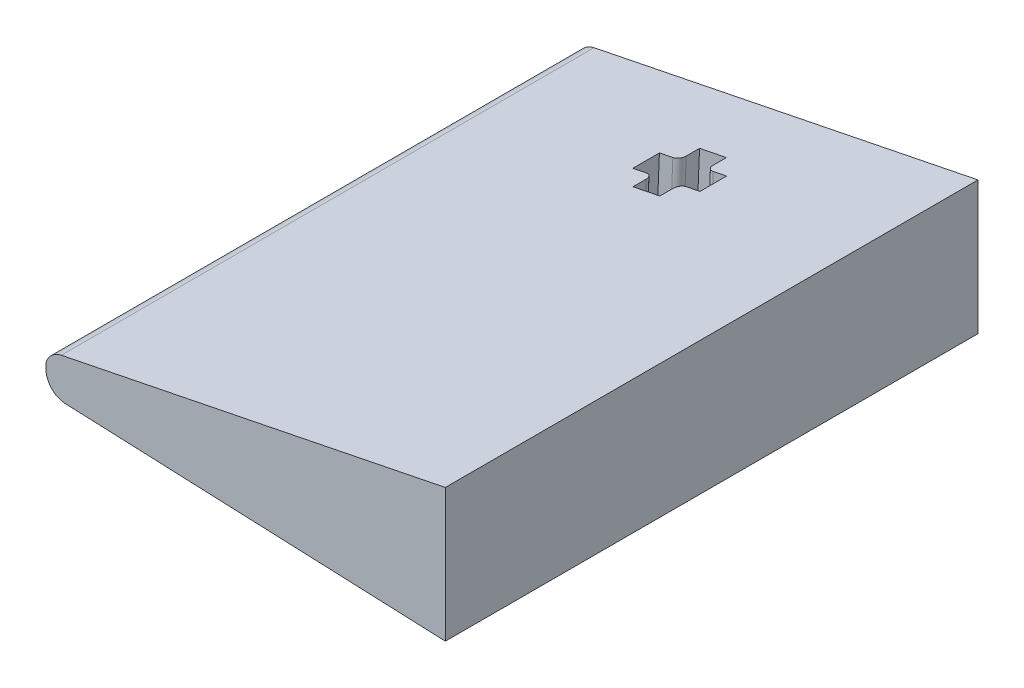
ISO-10303-21;
HEADER;
FILE_DESCRIPTION(('STEP AP214'),'2;1');
FILE_NAME('part.step','',(''),(''),'','','');
FILE_SCHEMA(('AUTOMOTIVE_DESIGN { 1 0 10303 214 1 1 1 1 }'));
ENDSEC;
DATA;
#1=APPLICATION_CONTEXT('core data for automotive mechanical design processes');
#2=APPLICATION_PROTOCOL_DEFINITION('international standard','automotive_design',2000,#1);
#3=PRODUCT_CONTEXT('',#1,'mechanical');
#4=PRODUCT('Part','Part','',(#3));
#5=PRODUCT_RELATED_PRODUCT_CATEGORY('part','',(#4));
#6=PRODUCT_DEFINITION_FORMATION('','',#4);
#7=PRODUCT_DEFINITION_CONTEXT('part definition',#1,'design');
#8=PRODUCT_DEFINITION('design','',#6,#7);
#9=PRODUCT_DEFINITION_SHAPE('','',#8);
#10=(LENGTH_UNIT() NAMED_UNIT(*) SI_UNIT(.MILLI.,.METRE.));
#11=(NAMED_UNIT(*) PLANE_ANGLE_UNIT() SI_UNIT($,.RADIAN.));
#12=(NAMED_UNIT(*) SI_UNIT($,.STERADIAN.) SOLID_ANGLE_UNIT());
#13=UNCERTAINTY_MEASURE_WITH_UNIT(LENGTH_MEASURE(1.E-05),#10,'distance_accuracy_value','');
#14=(GEOMETRIC_REPRESENTATION_CONTEXT(3) GLOBAL_UNCERTAINTY_ASSIGNED_CONTEXT((#13)) GLOBAL_UNIT_ASSIGNED_CONTEXT((#10,
#11,#12)) REPRESENTATION_CONTEXT('',''));
#15=CARTESIAN_POINT('',(0.,0.,0.));
#16=DIRECTION('',(0.,0.,1.));
#17=DIRECTION('',(1.,0.,0.));
#18=AXIS2_PLACEMENT_3D('',#15,#16,#17);
#19=CARTESIAN_POINT('',(1.21503963381001,-0.459096074768694,40.));
#20=DIRECTION('',(0.197787576974888,-0.980244905314178,0.));
#21=DIRECTION('',(0.980244905314178,0.197787576974888,0.));
#22=AXIS2_PLACEMENT_3D('',#19,#20,#21);
#23=PLANE('',#22);
#24=DIRECTION('',(-0.980244905314178,-0.197787576974888,0.));
#25=VECTOR('',#24,1.);
#26=CARTESIAN_POINT('',(1.21503963381001,-0.459096074768694,0.));
#27=LINE('',#26,#25);
#28=CARTESIAN_POINT('',(30.0476653891835,5.35856760811605,0.));
#29=VERTEX_POINT('',#28);
#30=CARTESIAN_POINT('',(1.21503963381001,-0.459096074768694,0.));
#31=VERTEX_POINT('',#30);
#32=EDGE_CURVE('E329',#29,#31,#27,.T.);
#33=ORIENTED_EDGE('',*,*,#32,.T.);
#34=DIRECTION('',(0.,0.,-1.));
#35=VECTOR('',#34,1.);
#36=CARTESIAN_POINT('',(1.21503963381001,-0.459096074768694,40.));
#37=LINE('',#36,#35);
#38=CARTESIAN_POINT('',(1.21503963381001,-0.459096074768694,40.));
#39=VERTEX_POINT('',#38);
#40=EDGE_CURVE('E41',#39,#31,#37,.T.);
#41=ORIENTED_EDGE('',*,*,#40,.F.);
#42=DIRECTION('',(-0.980244905314178,-0.197787576974888,0.));
#43=VECTOR('',#42,1.);
#44=CARTESIAN_POINT('',(1.21503963381001,-0.459096074768694,40.));
#45=LINE('',#44,#43);
#46=CARTESIAN_POINT('',(30.0476653891835,5.35856760811605,40.));
#47=VERTEX_POINT('',#46);
#48=EDGE_CURVE('E316',#47,#39,#45,.T.);
#49=ORIENTED_EDGE('',*,*,#48,.F.);
#50=DIRECTION('',(0.,0.,-1.));
#51=VECTOR('',#50,1.);
#52=CARTESIAN_POINT('',(30.0476653891835,5.35856760811605,40.));
#53=LINE('',#52,#51);
#54=EDGE_CURVE('E11',#47,#29,#53,.T.);
#55=ORIENTED_EDGE('',*,*,#54,.T.);
#56=EDGE_LOOP('',(#33,#41,#49,#55));
#57=FACE_BOUND('',#56,.T.);
#58=DIRECTION('',(-0.980244905314178,-0.197787576974888,0.));
#59=VECTOR('',#58,1.);
#60=CARTESIAN_POINT('',(1.21503963381001,-0.459096074768694,5.23864527795705));
#61=LINE('',#60,#59);
#62=CARTESIAN_POINT('',(16.3956877775301,2.60395847106687,5.23864527795705));
#63=VERTEX_POINT('',#62);
#64=CARTESIAN_POINT('',(14.3770940319794,2.19665947500511,5.23864527795705));
#65=VERTEX_POINT('',#64);
#66=EDGE_CURVE('E308',#63,#65,#61,.T.);
#67=ORIENTED_EDGE('',*,*,#66,.F.);
#68=DIRECTION('',(0.,0.,1.));
#69=VECTOR('',#68,1.);
#70=CARTESIAN_POINT('',(16.3956877775301,2.60395847106687,40.));
#71=LINE('',#70,#69);
#72=CARTESIAN_POINT('',(16.3956877775301,2.60395847106687,6.23864527795705));
#73=VERTEX_POINT('',#72);
#74=EDGE_CURVE('E310',#63,#73,#71,.T.);
#75=ORIENTED_EDGE('',*,*,#74,.T.);
#76=CARTESIAN_POINT('',(16.9003362139178,2.7057832200823,6.23864527795706));
#77=DIRECTION('',(0.197787576974888,-0.980244905314178,0.));
#78=DIRECTION('',(-0.980244905314178,-0.197787576974888,0.));
#79=AXIS2_PLACEMENT_3D('',#76,#77,#78);
#80=ELLIPSE('',#79,0.514818729127623,0.5);
#81=CARTESIAN_POINT('',(16.9003362139178,2.7057832200823,6.73864527795706));
#82=VERTEX_POINT('',#81);
#83=EDGE_CURVE('E244',#73,#82,#80,.F.);
#84=ORIENTED_EDGE('',*,*,#83,.T.);
#85=DIRECTION('',(0.980244905314178,0.197787576974888,0.));
#86=VECTOR('',#85,1.);
#87=CARTESIAN_POINT('',(1.21503963381001,-0.459096074768694,6.73864527795705));
#88=LINE('',#87,#86);
#89=CARTESIAN_POINT('',(17.9096330866932,2.90943271811318,6.73864527795705));
#90=VERTEX_POINT('',#89);
#91=EDGE_CURVE('E188',#82,#90,#88,.T.);
#92=ORIENTED_EDGE('',*,*,#91,.T.);
#93=DIRECTION('',(0.,0.,-1.));
#94=VECTOR('',#93,1.);
#95=CARTESIAN_POINT('',(17.9096330866932,2.9094327181132,40.));
#96=LINE('',#95,#94);
#97=CARTESIAN_POINT('',(17.9096330866932,2.90943271811323,8.73864527795706));
#98=VERTEX_POINT('',#97);
#99=EDGE_CURVE('E273',#98,#90,#96,.T.);
#100=ORIENTED_EDGE('',*,*,#99,.F.);
#101=DIRECTION('',(-0.980244905314178,-0.197787576974888,0.));
#102=VECTOR('',#101,1.);
#103=CARTESIAN_POINT('',(1.21503963381001,-0.459096074768694,8.73864527795706));
#104=LINE('',#103,#102);
#105=CARTESIAN_POINT('',(16.9003362139178,2.70578322008229,8.73864527795706));
#106=VERTEX_POINT('',#105);
#107=EDGE_CURVE('E275',#98,#106,#104,.T.);
#108=ORIENTED_EDGE('',*,*,#107,.T.);
#109=CARTESIAN_POINT('',(16.9003362139178,2.7057832200823,9.23864527795706));
#110=DIRECTION('',(0.197787576974888,-0.980244905314178,0.));
#111=DIRECTION('',(-0.980244905314178,-0.197787576974888,0.));
#112=AXIS2_PLACEMENT_3D('',#109,#110,#111);
#113=ELLIPSE('',#112,0.514818729127624,0.5);
#114=CARTESIAN_POINT('',(16.3956877775301,2.60395847106687,9.23864527795706));
#115=VERTEX_POINT('',#114);
#116=EDGE_CURVE('E278',#106,#115,#113,.F.);
#117=ORIENTED_EDGE('',*,*,#116,.T.);
#118=DIRECTION('',(0.,0.,1.));
#119=VECTOR('',#118,1.);
#120=CARTESIAN_POINT('',(16.3956877775301,2.60395847106687,40.));
#121=LINE('',#120,#119);
#122=CARTESIAN_POINT('',(16.3956877775301,2.6039584710669,10.2386452779571));
#123=VERTEX_POINT('',#122);
#124=EDGE_CURVE('E281',#115,#123,#121,.T.);
#125=ORIENTED_EDGE('',*,*,#124,.T.);
#126=DIRECTION('',(-0.980244905314178,-0.197787576974888,0.));
#127=VECTOR('',#126,1.);
#128=CARTESIAN_POINT('',(1.21503963381001,-0.459096074768694,10.2386452779571));
#129=LINE('',#128,#127);
#130=CARTESIAN_POINT('',(14.3770940319794,2.19665947500507,10.2386452779571));
#131=VERTEX_POINT('',#130);
#132=EDGE_CURVE('E284',#123,#131,#129,.T.);
#133=ORIENTED_EDGE('',*,*,#132,.T.);
#134=DIRECTION('',(0.,0.,-1.));
#135=VECTOR('',#134,1.);
#136=CARTESIAN_POINT('',(14.3770940319794,2.19665947500509,40.));
#137=LINE('',#136,#135);
#138=CARTESIAN_POINT('',(14.3770940319794,2.19665947500511,9.23864527795706));
#139=VERTEX_POINT('',#138);
#140=EDGE_CURVE('E287',#131,#139,#137,.T.);
#141=ORIENTED_EDGE('',*,*,#140,.T.);
#142=CARTESIAN_POINT('',(13.8724455955918,2.09483472598965,9.23864527795706));
#143=DIRECTION('',(0.197787576974888,-0.980244905314178,0.));
#144=DIRECTION('',(-0.980244905314178,-0.197787576974888,0.));
#145=AXIS2_PLACEMENT_3D('',#142,#143,#144);
#146=ELLIPSE('',#145,0.514818729127624,0.5);
#147=CARTESIAN_POINT('',(13.8724455955918,2.09483472598965,8.73864527795706));
#148=VERTEX_POINT('',#147);
#149=EDGE_CURVE('E290',#139,#148,#146,.F.);
#150=ORIENTED_EDGE('',*,*,#149,.T.);
#151=DIRECTION('',(-0.980244905314178,-0.197787576974888,0.));
#152=VECTOR('',#151,1.);
#153=CARTESIAN_POINT('',(1.21503963381001,-0.459096074768694,8.73864527795706));
#154=LINE('',#153,#152);
#155=CARTESIAN_POINT('',(12.8631487228164,1.89118522795874,8.73864527795706));
#156=VERTEX_POINT('',#155);
#157=EDGE_CURVE('E293',#148,#156,#154,.T.);
#158=ORIENTED_EDGE('',*,*,#157,.T.);
#159=DIRECTION('',(0.,0.,-1.));
#160=VECTOR('',#159,1.);
#161=CARTESIAN_POINT('',(12.8631487228164,1.89118522795876,40.));
#162=LINE('',#161,#160);
#163=CARTESIAN_POINT('',(12.8631487228164,1.89118522795878,6.73864527795706));
#164=VERTEX_POINT('',#163);
#165=EDGE_CURVE('E296',#156,#164,#162,.T.);
#166=ORIENTED_EDGE('',*,*,#165,.T.);
#167=DIRECTION('',(0.980244905314178,0.197787576974888,0.));
#168=VECTOR('',#167,1.);
#169=CARTESIAN_POINT('',(1.21503963381001,-0.459096074768694,6.73864527795705));
#170=LINE('',#169,#168);
#171=CARTESIAN_POINT('',(13.8724455955918,2.09483472598964,6.73864527795706));
#172=VERTEX_POINT('',#171);
#173=EDGE_CURVE('E299',#164,#172,#170,.T.);
#174=ORIENTED_EDGE('',*,*,#173,.T.);
#175=CARTESIAN_POINT('',(13.8724455955918,2.09483472598965,6.23864527795706));
#176=DIRECTION('',(0.197787576974888,-0.980244905314178,0.));
#177=DIRECTION('',(-0.980244905314178,-0.197787576974888,0.));
#178=AXIS2_PLACEMENT_3D('',#175,#176,#177);
#179=ELLIPSE('',#178,0.514818729127623,0.5);
#180=CARTESIAN_POINT('',(14.3770940319794,2.19665947500511,6.23864527795705));
#181=VERTEX_POINT('',#180);
#182=EDGE_CURVE('E302',#172,#181,#179,.F.);
#183=ORIENTED_EDGE('',*,*,#182,.T.);
#184=DIRECTION('',(0.,0.,-1.));
#185=VECTOR('',#184,1.);
#186=CARTESIAN_POINT('',(14.3770940319794,2.19665947500509,40.));
#187=LINE('',#186,#185);
#188=EDGE_CURVE('E305',#181,#65,#187,.T.);
#189=ORIENTED_EDGE('',*,*,#188,.T.);
#190=EDGE_LOOP('',(#67,#75,#84,#92,#100,#108,#117,#125,#133,#141,#150,#158,#166,#174,#183,#189));
#191=FACE_BOUND('',#190,.T.);
#192=ADVANCED_FACE('F33',(#57,#191),#23,.F.);
#193=CARTESIAN_POINT('',(1.51461089863944,-3.45909607476869,40.));
#194=DIRECTION('',(0.041401895878762,0.99914257391908,0.));
#195=DIRECTION('',(-0.99914257391908,0.041401895878762,0.));
#196=AXIS2_PLACEMENT_3D('',#193,#194,#195);
#197=PLANE('',#196);
#198=DIRECTION('',(0.99914257391908,-0.041401895878762,0.));
#199=VECTOR('',#198,1.);
#200=CARTESIAN_POINT('',(1.51461089863944,-3.45909607476869,0.));
#201=LINE('',#200,#199);
#202=CARTESIAN_POINT('',(1.51461089863944,-3.45909607476869,0.));
#203=VERTEX_POINT('',#202);
#204=CARTESIAN_POINT('',(30.0476653891835,-4.64143239188395,0.));
#205=VERTEX_POINT('',#204);
#206=EDGE_CURVE('E317',#203,#205,#201,.T.);
#207=ORIENTED_EDGE('',*,*,#206,.T.);
#208=DIRECTION('',(0.,0.,-1.));
#209=VECTOR('',#208,1.);
#210=CARTESIAN_POINT('',(30.0476653891835,-4.64143239188395,40.));
#211=LINE('',#210,#209);
#212=CARTESIAN_POINT('',(30.0476653891835,-4.64143239188395,40.));
#213=VERTEX_POINT('',#212);
#214=EDGE_CURVE('E327',#213,#205,#211,.T.);
#215=ORIENTED_EDGE('',*,*,#214,.F.);
#216=DIRECTION('',(0.99914257391908,-0.041401895878762,0.));
#217=VECTOR('',#216,1.);
#218=CARTESIAN_POINT('',(1.51461089863944,-3.45909607476869,40.));
#219=LINE('',#218,#217);
#220=CARTESIAN_POINT('',(1.51461089863944,-3.45909607476869,40.));
#221=VERTEX_POINT('',#220);
#222=EDGE_CURVE('E325',#221,#213,#219,.T.);
#223=ORIENTED_EDGE('',*,*,#222,.F.);
#224=DIRECTION('',(0.,0.,-1.));
#225=VECTOR('',#224,1.);
#226=CARTESIAN_POINT('',(1.51461089863944,-3.45909607476869,40.));
#227=LINE('',#226,#225);
#228=EDGE_CURVE('E341',#221,#203,#227,.T.);
#229=ORIENTED_EDGE('',*,*,#228,.T.);
#230=EDGE_LOOP('',(#207,#215,#223,#229));
#231=FACE_BOUND('',#230,.T.);
#232=CARTESIAN_POINT('',(16.6189444376513,-4.08498076912955,6.23864527795706));
#233=DIRECTION('',(-0.041401895878762,-0.99914257391908,0.));
#234=DIRECTION('',(0.99914257391908,-0.041401895878762,0.));
#235=AXIS2_PLACEMENT_3D('',#232,#233,#234);
#236=CIRCLE('',#235,0.5);
#237=CARTESIAN_POINT('',(16.1193731506917,-4.06427982119017,6.23864527795706));
#238=VERTEX_POINT('',#237);
#239=CARTESIAN_POINT('',(16.6189444376513,-4.08498076912955,6.73864527795706));
#240=VERTEX_POINT('',#239);
#241=EDGE_CURVE('E194',#238,#240,#236,.F.);
#242=ORIENTED_EDGE('',*,*,#241,.F.);
#243=DIRECTION('',(0.,0.,1.));
#244=VECTOR('',#243,1.);
#245=CARTESIAN_POINT('',(16.1193731506917,-4.06427982119017,0.));
#246=LINE('',#245,#244);
#247=CARTESIAN_POINT('',(16.1193731506918,-4.06427982119017,5.23864527795705));
#248=VERTEX_POINT('',#247);
#249=EDGE_CURVE('E56',#248,#238,#246,.T.);
#250=ORIENTED_EDGE('',*,*,#249,.F.);
#251=DIRECTION('',(-0.99914257391908,0.041401895878762,0.));
#252=VECTOR('',#251,1.);
#253=CARTESIAN_POINT('',(-0.140494120581662,-3.39051278399226,5.23864527795705));
#254=LINE('',#253,#252);
#255=CARTESIAN_POINT('',(14.1210880028536,-3.98147602943265,5.23864527795705));
#256=VERTEX_POINT('',#255);
#257=EDGE_CURVE('E239',#248,#256,#254,.T.);
#258=ORIENTED_EDGE('',*,*,#257,.T.);
#259=DIRECTION('',(0.,0.,-1.));
#260=VECTOR('',#259,1.);
#261=CARTESIAN_POINT('',(14.1210880028536,-3.98147602943265,0.));
#262=LINE('',#261,#260);
#263=CARTESIAN_POINT('',(14.1210880028536,-3.98147602943265,6.23864527795705));
#264=VERTEX_POINT('',#263);
#265=EDGE_CURVE('E236',#264,#256,#262,.T.);
#266=ORIENTED_EDGE('',*,*,#265,.F.);
#267=CARTESIAN_POINT('',(13.621516715894,-3.96077508149326,6.23864527795706));
#268=DIRECTION('',(-0.041401895878762,-0.99914257391908,0.));
#269=DIRECTION('',(0.99914257391908,-0.041401895878762,0.));
#270=AXIS2_PLACEMENT_3D('',#267,#268,#269);
#271=CIRCLE('',#270,0.5);
#272=CARTESIAN_POINT('',(13.621516715894,-3.96077508149326,6.73864527795706));
#273=VERTEX_POINT('',#272);
#274=EDGE_CURVE('E233',#273,#264,#271,.F.);
#275=ORIENTED_EDGE('',*,*,#274,.F.);
#276=DIRECTION('',(0.99914257391908,-0.041401895878762,0.));
#277=VECTOR('',#276,1.);
#278=CARTESIAN_POINT('',(-0.140494120581662,-3.39051278399226,6.73864527795706));
#279=LINE('',#278,#277);
#280=CARTESIAN_POINT('',(12.622374141975,-3.9193731856145,6.73864527795706));
#281=VERTEX_POINT('',#280);
#282=EDGE_CURVE('E230',#281,#273,#279,.T.);
#283=ORIENTED_EDGE('',*,*,#282,.F.);
#284=DIRECTION('',(0.,0.,-1.));
#285=VECTOR('',#284,1.);
#286=CARTESIAN_POINT('',(12.622374141975,-3.9193731856145,0.));
#287=LINE('',#286,#285);
#288=CARTESIAN_POINT('',(12.622374141975,-3.9193731856145,8.73864527795706));
#289=VERTEX_POINT('',#288);
#290=EDGE_CURVE('E227',#289,#281,#287,.T.);
#291=ORIENTED_EDGE('',*,*,#290,.F.);
#292=DIRECTION('',(-0.99914257391908,0.041401895878762,0.));
#293=VECTOR('',#292,1.);
#294=CARTESIAN_POINT('',(-0.140494120581662,-3.39051278399226,8.73864527795706));
#295=LINE('',#294,#293);
#296=CARTESIAN_POINT('',(13.621516715894,-3.96077508149326,8.73864527795706));
#297=VERTEX_POINT('',#296);
#298=EDGE_CURVE('E224',#297,#289,#295,.T.);
#299=ORIENTED_EDGE('',*,*,#298,.F.);
#300=CARTESIAN_POINT('',(13.621516715894,-3.96077508149326,9.23864527795706));
#301=DIRECTION('',(-0.041401895878762,-0.99914257391908,0.));
#302=DIRECTION('',(0.99914257391908,-0.041401895878762,0.));
#303=AXIS2_PLACEMENT_3D('',#300,#301,#302);
#304=CIRCLE('',#303,0.5);
#305=CARTESIAN_POINT('',(14.1210880028536,-3.98147602943265,9.23864527795706));
#306=VERTEX_POINT('',#305);
#307=EDGE_CURVE('E221',#306,#297,#304,.F.);
#308=ORIENTED_EDGE('',*,*,#307,.F.);
#309=DIRECTION('',(0.,0.,-1.));
#310=VECTOR('',#309,1.);
#311=CARTESIAN_POINT('',(14.1210880028536,-3.98147602943265,0.));
#312=LINE('',#311,#310);
#313=CARTESIAN_POINT('',(14.1210880028536,-3.98147602943265,10.2386452779571));
#314=VERTEX_POINT('',#313);
#315=EDGE_CURVE('E218',#314,#306,#312,.T.);
#316=ORIENTED_EDGE('',*,*,#315,.F.);
#317=DIRECTION('',(-0.99914257391908,0.041401895878762,0.));
#318=VECTOR('',#317,1.);
#319=CARTESIAN_POINT('',(-0.140494120581662,-3.39051278399226,10.2386452779571));
#320=LINE('',#319,#318);
#321=CARTESIAN_POINT('',(16.1193731506917,-4.06427982119017,10.2386452779571));
#322=VERTEX_POINT('',#321);
#323=EDGE_CURVE('E215',#322,#314,#320,.T.);
#324=ORIENTED_EDGE('',*,*,#323,.F.);
#325=DIRECTION('',(0.,0.,1.));
#326=VECTOR('',#325,1.);
#327=CARTESIAN_POINT('',(16.1193731506917,-4.06427982119017,0.));
#328=LINE('',#327,#326);
#329=CARTESIAN_POINT('',(16.1193731506917,-4.06427982119017,9.23864527795706));
#330=VERTEX_POINT('',#329);
#331=EDGE_CURVE('E212',#330,#322,#328,.T.);
#332=ORIENTED_EDGE('',*,*,#331,.F.);
#333=CARTESIAN_POINT('',(16.6189444376513,-4.08498076912955,9.23864527795706));
#334=DIRECTION('',(-0.041401895878762,-0.99914257391908,0.));
#335=DIRECTION('',(0.99914257391908,-0.041401895878762,0.));
#336=AXIS2_PLACEMENT_3D('',#333,#334,#335);
#337=CIRCLE('',#336,0.5);
#338=CARTESIAN_POINT('',(16.6189444376513,-4.08498076912955,8.73864527795706));
#339=VERTEX_POINT('',#338);
#340=EDGE_CURVE('E209',#339,#330,#337,.F.);
#341=ORIENTED_EDGE('',*,*,#340,.F.);
#342=DIRECTION('',(-0.99914257391908,0.041401895878762,0.));
#343=VECTOR('',#342,1.);
#344=CARTESIAN_POINT('',(-0.140494120581662,-3.39051278399226,8.73864527795706));
#345=LINE('',#344,#343);
#346=CARTESIAN_POINT('',(17.6180870115704,-4.12638266500831,8.73864527795706));
#347=VERTEX_POINT('',#346);
#348=EDGE_CURVE('E203',#347,#339,#345,.T.);
#349=ORIENTED_EDGE('',*,*,#348,.F.);
#350=DIRECTION('',(0.,0.,-1.));
#351=VECTOR('',#350,1.);
#352=CARTESIAN_POINT('',(17.6180870115704,-4.12638266500831,0.));
#353=LINE('',#352,#351);
#354=CARTESIAN_POINT('',(17.6180870115704,-4.12638266500831,6.73864527795706));
#355=VERTEX_POINT('',#354);
#356=EDGE_CURVE('E201',#347,#355,#353,.T.);
#357=ORIENTED_EDGE('',*,*,#356,.T.);
#358=DIRECTION('',(0.99914257391908,-0.041401895878762,0.));
#359=VECTOR('',#358,1.);
#360=CARTESIAN_POINT('',(-0.140494120581662,-3.39051278399226,6.73864527795706));
#361=LINE('',#360,#359);
#362=EDGE_CURVE('E185',#240,#355,#361,.T.);
#363=ORIENTED_EDGE('',*,*,#362,.F.);
#364=EDGE_LOOP('',(#242,#250,#258,#266,#275,#283,#291,#299,#308,#316,#324,#332,#341,#349,#357,#363));
#365=FACE_BOUND('',#364,.T.);
#366=ADVANCED_FACE('F198',(#231,#365),#197,.F.);
#367=CARTESIAN_POINT('',(30.0476653891835,0.,40.));
#368=DIRECTION('',(-1.,0.,0.));
#369=DIRECTION('',(0.,0.,1.));
#370=AXIS2_PLACEMENT_3D('',#367,#368,#369);
#371=PLANE('',#370);
#372=DIRECTION('',(0.,1.,0.));
#373=VECTOR('',#372,1.);
#374=CARTESIAN_POINT('',(30.0476653891835,0.,0.));
#375=LINE('',#374,#373);
#376=EDGE_CURVE('E313',#205,#29,#375,.T.);
#377=ORIENTED_EDGE('',*,*,#376,.T.);
#378=ORIENTED_EDGE('',*,*,#54,.F.);
#379=DIRECTION('',(0.,1.,0.));
#380=VECTOR('',#379,1.);
#381=CARTESIAN_POINT('',(30.0476653891835,0.,40.));
#382=LINE('',#381,#380);
#383=EDGE_CURVE('E314',#213,#47,#382,.T.);
#384=ORIENTED_EDGE('',*,*,#383,.F.);
#385=ORIENTED_EDGE('',*,*,#214,.T.);
#386=EDGE_LOOP('',(#377,#378,#384,#385));
#387=FACE_BOUND('',#386,.T.);
#388=ADVANCED_FACE('F35',(#387),#371,.F.);
#389=CARTESIAN_POINT('',(1.51461084238529,-1.94378563655049,40.));
#390=DIRECTION('',(0.,0.,-1.));
#391=DIRECTION('',(-1.,0.,0.));
#392=AXIS2_PLACEMENT_3D('',#389,#390,#391);
#393=CYLINDRICAL_SURFACE('',#392,1.51461084238529);
#394=CARTESIAN_POINT('',(1.51461084238529,-1.94378563655049,0.));
#395=DIRECTION('',(0.,0.,1.));
#396=DIRECTION('',(-1.,0.,0.));
#397=AXIS2_PLACEMENT_3D('',#394,#395,#396);
#398=CIRCLE('',#397,1.51461084238529);
#399=CARTESIAN_POINT('',(0.0627078166474285,-1.51248109481192,0.));
#400=VERTEX_POINT('',#399);
#401=EDGE_CURVE('E331',#31,#400,#398,.T.);
#402=ORIENTED_EDGE('',*,*,#401,.T.);
#403=DIRECTION('',(0.,0.,-1.));
#404=VECTOR('',#403,1.);
#405=CARTESIAN_POINT('',(0.0627078166474285,-1.51248109481192,40.));
#406=LINE('',#405,#404);
#407=CARTESIAN_POINT('',(0.0627078166474285,-1.51248109481192,40.));
#408=VERTEX_POINT('',#407);
#409=EDGE_CURVE('E347',#408,#400,#406,.T.);
#410=ORIENTED_EDGE('',*,*,#409,.F.);
#411=CARTESIAN_POINT('',(1.51461084238529,-1.94378563655049,40.));
#412=DIRECTION('',(0.,0.,1.));
#413=DIRECTION('',(-1.,0.,0.));
#414=AXIS2_PLACEMENT_3D('',#411,#412,#413);
#415=CIRCLE('',#414,1.51461084238529);
#416=EDGE_CURVE('E319',#39,#408,#415,.T.);
#417=ORIENTED_EDGE('',*,*,#416,.F.);
#418=ORIENTED_EDGE('',*,*,#40,.T.);
#419=EDGE_LOOP('',(#402,#410,#417,#418));
#420=FACE_BOUND('',#419,.T.);
#421=ADVANCED_FACE('F354',(#420),#393,.T.);
#422=CARTESIAN_POINT('',(0.0627078166474282,-1.51248109481192,40.));
#423=DIRECTION('',(1.,0.,0.));
#424=DIRECTION('',(0.,0.,-1.));
#425=AXIS2_PLACEMENT_3D('',#422,#423,#424);
#426=PLANE('',#425);
#427=DIRECTION('',(0.,-1.,0.));
#428=VECTOR('',#427,1.);
#429=CARTESIAN_POINT('',(0.0627078166474282,-1.51248109481192,0.));
#430=LINE('',#429,#428);
#431=CARTESIAN_POINT('',(0.0627078166474282,-1.94578389922211,0.));
#432=VERTEX_POINT('',#431);
#433=EDGE_CURVE('E333',#400,#432,#430,.T.);
#434=ORIENTED_EDGE('',*,*,#433,.T.);
#435=DIRECTION('',(0.,0.,-1.));
#436=VECTOR('',#435,1.);
#437=CARTESIAN_POINT('',(0.0627078166474282,-1.94578389922211,40.));
#438=LINE('',#437,#436);
#439=CARTESIAN_POINT('',(0.0627078166474282,-1.94578389922211,40.));
#440=VERTEX_POINT('',#439);
#441=EDGE_CURVE('E344',#440,#432,#438,.T.);
#442=ORIENTED_EDGE('',*,*,#441,.F.);
#443=DIRECTION('',(0.,-1.,0.));
#444=VECTOR('',#443,1.);
#445=CARTESIAN_POINT('',(0.0627078166474282,-1.51248109481192,40.));
#446=LINE('',#445,#444);
#447=EDGE_CURVE('E321',#408,#440,#446,.T.);
#448=ORIENTED_EDGE('',*,*,#447,.F.);
#449=ORIENTED_EDGE('',*,*,#409,.T.);
#450=EDGE_LOOP('',(#434,#442,#448,#449));
#451=FACE_BOUND('',#450,.T.);
#452=ADVANCED_FACE('F366',(#451),#426,.F.);
#453=CARTESIAN_POINT('',(1.57731865903272,-1.94578389922211,40.));
#454=DIRECTION('',(0.,0.,-1.));
#455=DIRECTION('',(-1.,0.,0.));
#456=AXIS2_PLACEMENT_3D('',#453,#454,#455);
#457=CYLINDRICAL_SURFACE('',#456,1.51461084238529);
#458=CARTESIAN_POINT('',(1.57731865903272,-1.94578389922211,0.));
#459=DIRECTION('',(0.,0.,1.));
#460=DIRECTION('',(-1.,0.,0.));
#461=AXIS2_PLACEMENT_3D('',#458,#459,#460);
#462=CIRCLE('',#461,1.51461084238529);
#463=EDGE_CURVE('E335',#432,#203,#462,.T.);
#464=ORIENTED_EDGE('',*,*,#463,.T.);
#465=ORIENTED_EDGE('',*,*,#228,.F.);
#466=CARTESIAN_POINT('',(1.57731865903272,-1.94578389922211,40.));
#467=DIRECTION('',(0.,0.,1.));
#468=DIRECTION('',(-1.,0.,0.));
#469=AXIS2_PLACEMENT_3D('',#466,#467,#468);
#470=CIRCLE('',#469,1.51461084238529);
#471=EDGE_CURVE('E323',#440,#221,#470,.T.);
#472=ORIENTED_EDGE('',*,*,#471,.F.);
#473=ORIENTED_EDGE('',*,*,#441,.T.);
#474=EDGE_LOOP('',(#464,#465,#472,#473));
#475=FACE_BOUND('',#474,.T.);
#476=ADVANCED_FACE('F370',(#475),#457,.T.);
#477=CARTESIAN_POINT('',(1.57731865903272,-1.94578389922211,40.));
#478=DIRECTION('',(0.,0.,-1.));
#479=DIRECTION('',(-1.,0.,0.));
#480=AXIS2_PLACEMENT_3D('',#477,#478,#479);
#481=PLANE('',#480);
#482=ORIENTED_EDGE('',*,*,#383,.T.);
#483=ORIENTED_EDGE('',*,*,#48,.T.);
#484=ORIENTED_EDGE('',*,*,#416,.T.);
#485=ORIENTED_EDGE('',*,*,#447,.T.);
#486=ORIENTED_EDGE('',*,*,#471,.T.);
#487=ORIENTED_EDGE('',*,*,#222,.T.);
#488=EDGE_LOOP('',(#482,#483,#484,#485,#486,#487));
#489=FACE_BOUND('',#488,.T.);
#490=ADVANCED_FACE('F374',(#489),#481,.F.);
#491=CARTESIAN_POINT('',(1.57731865903272,-1.94578389922211,0.));
#492=DIRECTION('',(0.,0.,-1.));
#493=DIRECTION('',(-1.,0.,0.));
#494=AXIS2_PLACEMENT_3D('',#491,#492,#493);
#495=PLANE('',#494);
#496=ORIENTED_EDGE('',*,*,#376,.F.);
#497=ORIENTED_EDGE('',*,*,#206,.F.);
#498=ORIENTED_EDGE('',*,*,#463,.F.);
#499=ORIENTED_EDGE('',*,*,#433,.F.);
#500=ORIENTED_EDGE('',*,*,#401,.F.);
#501=ORIENTED_EDGE('',*,*,#32,.F.);
#502=EDGE_LOOP('',(#496,#497,#498,#499,#500,#501));
#503=FACE_BOUND('',#502,.T.);
#504=ADVANCED_FACE('F361',(#503),#495,.T.);
#505=CARTESIAN_POINT('',(26.0144262657159,234.73079534547,0.));
#506=DIRECTION('',(0.99914257391908,-0.041401895878762,0.));
#507=DIRECTION('',(0.041401895878762,0.99914257391908,0.));
#508=AXIS2_PLACEMENT_3D('',#505,#506,#507);
#509=PLANE('',#508);
#510=DIRECTION('',(-0.041401895878762,-0.99914257391908,0.));
#511=VECTOR('',#510,1.);
#512=CARTESIAN_POINT('',(26.0144262657159,234.73079534547,5.23864527795705));
#513=LINE('',#512,#511);
#514=EDGE_CURVE('E242',#63,#248,#513,.T.);
#515=ORIENTED_EDGE('',*,*,#514,.T.);
#516=ORIENTED_EDGE('',*,*,#249,.T.);
#517=DIRECTION('',(-0.041401895878762,-0.99914257391908,0.));
#518=VECTOR('',#517,1.);
#519=CARTESIAN_POINT('',(26.0144262657159,234.73079534547,6.23864527795705));
#520=LINE('',#519,#518);
#521=EDGE_CURVE('E191',#73,#238,#520,.T.);
#522=ORIENTED_EDGE('',*,*,#521,.F.);
#523=ORIENTED_EDGE('',*,*,#74,.F.);
#524=EDGE_LOOP('',(#515,#516,#522,#523));
#525=FACE_BOUND('',#524,.T.);
#526=ADVANCED_FACE('F418',(#525),#509,.F.);
#527=CARTESIAN_POINT('',(9.75455899444245,235.404562382668,5.23864527795705));
#528=DIRECTION('',(0.,0.,1.));
#529=DIRECTION('',(1.,0.,0.));
#530=AXIS2_PLACEMENT_3D('',#527,#528,#529);
#531=PLANE('',#530);
#532=ORIENTED_EDGE('',*,*,#66,.T.);
#533=DIRECTION('',(-0.041401895878762,-0.99914257391908,0.));
#534=VECTOR('',#533,1.);
#535=CARTESIAN_POINT('',(24.0161411178777,234.813599137228,5.23864527795705));
#536=LINE('',#535,#534);
#537=EDGE_CURVE('E245',#65,#256,#536,.T.);
#538=ORIENTED_EDGE('',*,*,#537,.T.);
#539=ORIENTED_EDGE('',*,*,#257,.F.);
#540=ORIENTED_EDGE('',*,*,#514,.F.);
#541=EDGE_LOOP('',(#532,#538,#539,#540));
#542=FACE_BOUND('',#541,.T.);
#543=ADVANCED_FACE('F425',(#542),#531,.T.);
#544=CARTESIAN_POINT('',(24.0161411178777,234.813599137228,0.));
#545=DIRECTION('',(-0.99914257391908,0.041401895878762,0.));
#546=DIRECTION('',(-0.041401895878762,-0.99914257391908,0.));
#547=AXIS2_PLACEMENT_3D('',#544,#545,#546);
#548=PLANE('',#547);
#549=DIRECTION('',(-0.041401895878762,-0.99914257391908,0.));
#550=VECTOR('',#549,1.);
#551=CARTESIAN_POINT('',(24.0161411178777,234.813599137228,6.23864527795705));
#552=LINE('',#551,#550);
#553=EDGE_CURVE('E247',#181,#264,#552,.T.);
#554=ORIENTED_EDGE('',*,*,#553,.T.);
#555=ORIENTED_EDGE('',*,*,#265,.T.);
#556=ORIENTED_EDGE('',*,*,#537,.F.);
#557=ORIENTED_EDGE('',*,*,#188,.F.);
#558=EDGE_LOOP('',(#554,#555,#556,#557));
#559=FACE_BOUND('',#558,.T.);
#560=ADVANCED_FACE('F432',(#559),#548,.F.);
#561=CARTESIAN_POINT('',(23.5165698309182,234.834300085167,6.23864527795706));
#562=DIRECTION('',(-0.041401895878762,-0.99914257391908,0.));
#563=DIRECTION('',(0.99914257391908,-0.041401895878762,0.));
#564=AXIS2_PLACEMENT_3D('',#561,#562,#563);
#565=CYLINDRICAL_SURFACE('',#564,0.5);
#566=DIRECTION('',(-0.041401895878762,-0.99914257391908,0.));
#567=VECTOR('',#566,1.);
#568=CARTESIAN_POINT('',(23.5165698309182,234.834300085167,6.73864527795706));
#569=LINE('',#568,#567);
#570=EDGE_CURVE('E249',#172,#273,#569,.T.);
#571=ORIENTED_EDGE('',*,*,#570,.T.);
#572=ORIENTED_EDGE('',*,*,#274,.T.);
#573=ORIENTED_EDGE('',*,*,#553,.F.);
#574=ORIENTED_EDGE('',*,*,#182,.F.);
#575=EDGE_LOOP('',(#571,#572,#573,#574));
#576=FACE_BOUND('',#575,.T.);
#577=ADVANCED_FACE('F440',(#576),#565,.T.);
#578=CARTESIAN_POINT('',(9.75455899444245,235.404562382668,6.73864527795706));
#579=DIRECTION('',(0.,0.,-1.));
#580=DIRECTION('',(-1.,0.,0.));
#581=AXIS2_PLACEMENT_3D('',#578,#579,#580);
#582=PLANE('',#581);
#583=DIRECTION('',(-0.041401895878762,-0.99914257391908,0.));
#584=VECTOR('',#583,1.);
#585=CARTESIAN_POINT('',(22.5174272569991,234.875701981046,6.73864527795706));
#586=LINE('',#585,#584);
#587=EDGE_CURVE('E251',#164,#281,#586,.T.);
#588=ORIENTED_EDGE('',*,*,#587,.T.);
#589=ORIENTED_EDGE('',*,*,#282,.T.);
#590=ORIENTED_EDGE('',*,*,#570,.F.);
#591=ORIENTED_EDGE('',*,*,#173,.F.);
#592=EDGE_LOOP('',(#588,#589,#590,#591));
#593=FACE_BOUND('',#592,.T.);
#594=ADVANCED_FACE('F448',(#593),#582,.F.);
#595=CARTESIAN_POINT('',(22.5174272569991,234.875701981046,0.));
#596=DIRECTION('',(-0.99914257391908,0.041401895878762,0.));
#597=DIRECTION('',(-0.041401895878762,-0.99914257391908,0.));
#598=AXIS2_PLACEMENT_3D('',#595,#596,#597);
#599=PLANE('',#598);
#600=DIRECTION('',(-0.041401895878762,-0.99914257391908,0.));
#601=VECTOR('',#600,1.);
#602=CARTESIAN_POINT('',(22.5174272569991,234.875701981046,8.73864527795706));
#603=LINE('',#602,#601);
#604=EDGE_CURVE('E253',#156,#289,#603,.T.);
#605=ORIENTED_EDGE('',*,*,#604,.T.);
#606=ORIENTED_EDGE('',*,*,#290,.T.);
#607=ORIENTED_EDGE('',*,*,#587,.F.);
#608=ORIENTED_EDGE('',*,*,#165,.F.);
#609=EDGE_LOOP('',(#605,#606,#607,#608));
#610=FACE_BOUND('',#609,.T.);
#611=ADVANCED_FACE('F456',(#610),#599,.F.);
#612=CARTESIAN_POINT('',(9.75455899444245,235.404562382668,8.73864527795706));
#613=DIRECTION('',(0.,0.,1.));
#614=DIRECTION('',(1.,0.,0.));
#615=AXIS2_PLACEMENT_3D('',#612,#613,#614);
#616=PLANE('',#615);
#617=DIRECTION('',(-0.041401895878762,-0.99914257391908,0.));
#618=VECTOR('',#617,1.);
#619=CARTESIAN_POINT('',(23.5165698309182,234.834300085167,8.73864527795706));
#620=LINE('',#619,#618);
#621=EDGE_CURVE('E255',#148,#297,#620,.T.);
#622=ORIENTED_EDGE('',*,*,#621,.T.);
#623=ORIENTED_EDGE('',*,*,#298,.T.);
#624=ORIENTED_EDGE('',*,*,#604,.F.);
#625=ORIENTED_EDGE('',*,*,#157,.F.);
#626=EDGE_LOOP('',(#622,#623,#624,#625));
#627=FACE_BOUND('',#626,.T.);
#628=ADVANCED_FACE('F464',(#627),#616,.F.);
#629=CARTESIAN_POINT('',(23.5165698309182,234.834300085167,9.23864527795706));
#630=DIRECTION('',(-0.041401895878762,-0.99914257391908,0.));
#631=DIRECTION('',(0.99914257391908,-0.041401895878762,0.));
#632=AXIS2_PLACEMENT_3D('',#629,#630,#631);
#633=CYLINDRICAL_SURFACE('',#632,0.5);
#634=DIRECTION('',(-0.041401895878762,-0.99914257391908,0.));
#635=VECTOR('',#634,1.);
#636=CARTESIAN_POINT('',(24.0161411178777,234.813599137228,9.23864527795706));
#637=LINE('',#636,#635);
#638=EDGE_CURVE('E257',#139,#306,#637,.T.);
#639=ORIENTED_EDGE('',*,*,#638,.T.);
#640=ORIENTED_EDGE('',*,*,#307,.T.);
#641=ORIENTED_EDGE('',*,*,#621,.F.);
#642=ORIENTED_EDGE('',*,*,#149,.F.);
#643=EDGE_LOOP('',(#639,#640,#641,#642));
#644=FACE_BOUND('',#643,.T.);
#645=ADVANCED_FACE('F472',(#644),#633,.T.);
#646=CARTESIAN_POINT('',(24.0161411178777,234.813599137228,0.));
#647=DIRECTION('',(-0.99914257391908,0.041401895878762,0.));
#648=DIRECTION('',(-0.041401895878762,-0.99914257391908,0.));
#649=AXIS2_PLACEMENT_3D('',#646,#647,#648);
#650=PLANE('',#649);
#651=DIRECTION('',(-0.041401895878762,-0.99914257391908,0.));
#652=VECTOR('',#651,1.);
#653=CARTESIAN_POINT('',(24.0161411178777,234.813599137228,10.2386452779571));
#654=LINE('',#653,#652);
#655=EDGE_CURVE('E259',#131,#314,#654,.T.);
#656=ORIENTED_EDGE('',*,*,#655,.T.);
#657=ORIENTED_EDGE('',*,*,#315,.T.);
#658=ORIENTED_EDGE('',*,*,#638,.F.);
#659=ORIENTED_EDGE('',*,*,#140,.F.);
#660=EDGE_LOOP('',(#656,#657,#658,#659));
#661=FACE_BOUND('',#660,.T.);
#662=ADVANCED_FACE('F480',(#661),#650,.F.);
#663=CARTESIAN_POINT('',(9.75455899444245,235.404562382668,10.2386452779571));
#664=DIRECTION('',(0.,0.,1.));
#665=DIRECTION('',(1.,0.,0.));
#666=AXIS2_PLACEMENT_3D('',#663,#664,#665);
#667=PLANE('',#666);
#668=DIRECTION('',(-0.041401895878762,-0.99914257391908,0.));
#669=VECTOR('',#668,1.);
#670=CARTESIAN_POINT('',(26.0144262657159,234.73079534547,10.2386452779571));
#671=LINE('',#670,#669);
#672=EDGE_CURVE('E261',#123,#322,#671,.T.);
#673=ORIENTED_EDGE('',*,*,#672,.T.);
#674=ORIENTED_EDGE('',*,*,#323,.T.);
#675=ORIENTED_EDGE('',*,*,#655,.F.);
#676=ORIENTED_EDGE('',*,*,#132,.F.);
#677=EDGE_LOOP('',(#673,#674,#675,#676));
#678=FACE_BOUND('',#677,.T.);
#679=ADVANCED_FACE('F488',(#678),#667,.F.);
#680=CARTESIAN_POINT('',(26.0144262657159,234.73079534547,0.));
#681=DIRECTION('',(0.99914257391908,-0.041401895878762,0.));
#682=DIRECTION('',(0.041401895878762,0.99914257391908,0.));
#683=AXIS2_PLACEMENT_3D('',#680,#681,#682);
#684=PLANE('',#683);
#685=DIRECTION('',(-0.041401895878762,-0.99914257391908,0.));
#686=VECTOR('',#685,1.);
#687=CARTESIAN_POINT('',(26.0144262657159,234.73079534547,9.23864527795706));
#688=LINE('',#687,#686);
#689=EDGE_CURVE('E263',#115,#330,#688,.T.);
#690=ORIENTED_EDGE('',*,*,#689,.T.);
#691=ORIENTED_EDGE('',*,*,#331,.T.);
#692=ORIENTED_EDGE('',*,*,#672,.F.);
#693=ORIENTED_EDGE('',*,*,#124,.F.);
#694=EDGE_LOOP('',(#690,#691,#692,#693));
#695=FACE_BOUND('',#694,.T.);
#696=ADVANCED_FACE('F496',(#695),#684,.F.);
#697=CARTESIAN_POINT('',(26.5139975526754,234.710094397531,9.23864527795706));
#698=DIRECTION('',(-0.041401895878762,-0.99914257391908,0.));
#699=DIRECTION('',(0.99914257391908,-0.041401895878762,0.));
#700=AXIS2_PLACEMENT_3D('',#697,#698,#699);
#701=CYLINDRICAL_SURFACE('',#700,0.5);
#702=DIRECTION('',(-0.041401895878762,-0.99914257391908,0.));
#703=VECTOR('',#702,1.);
#704=CARTESIAN_POINT('',(26.5139975526754,234.710094397531,8.73864527795706));
#705=LINE('',#704,#703);
#706=EDGE_CURVE('E265',#106,#339,#705,.T.);
#707=ORIENTED_EDGE('',*,*,#706,.T.);
#708=ORIENTED_EDGE('',*,*,#340,.T.);
#709=ORIENTED_EDGE('',*,*,#689,.F.);
#710=ORIENTED_EDGE('',*,*,#116,.F.);
#711=EDGE_LOOP('',(#707,#708,#709,#710));
#712=FACE_BOUND('',#711,.T.);
#713=ADVANCED_FACE('F504',(#712),#701,.T.);
#714=CARTESIAN_POINT('',(9.75455899444245,235.404562382668,8.73864527795706));
#715=DIRECTION('',(0.,0.,1.));
#716=DIRECTION('',(1.,0.,0.));
#717=AXIS2_PLACEMENT_3D('',#714,#715,#716);
#718=PLANE('',#717);
#719=DIRECTION('',(-0.041401895878762,-0.99914257391908,0.));
#720=VECTOR('',#719,1.);
#721=CARTESIAN_POINT('',(27.5131401265945,234.668692501652,8.73864527795706));
#722=LINE('',#721,#720);
#723=EDGE_CURVE('E267',#98,#347,#722,.T.);
#724=ORIENTED_EDGE('',*,*,#723,.T.);
#725=ORIENTED_EDGE('',*,*,#348,.T.);
#726=ORIENTED_EDGE('',*,*,#706,.F.);
#727=ORIENTED_EDGE('',*,*,#107,.F.);
#728=EDGE_LOOP('',(#724,#725,#726,#727));
#729=FACE_BOUND('',#728,.T.);
#730=ADVANCED_FACE('F512',(#729),#718,.F.);
#731=CARTESIAN_POINT('',(27.5131401265945,234.668692501652,0.));
#732=DIRECTION('',(-0.99914257391908,0.041401895878762,0.));
#733=DIRECTION('',(-0.041401895878762,-0.99914257391908,0.));
#734=AXIS2_PLACEMENT_3D('',#731,#732,#733);
#735=PLANE('',#734);
#736=ORIENTED_EDGE('',*,*,#99,.T.);
#737=DIRECTION('',(-0.041401895878762,-0.99914257391908,0.));
#738=VECTOR('',#737,1.);
#739=CARTESIAN_POINT('',(27.5131401265945,234.668692501652,6.73864527795706));
#740=LINE('',#739,#738);
#741=EDGE_CURVE('E190',#90,#355,#740,.T.);
#742=ORIENTED_EDGE('',*,*,#741,.T.);
#743=ORIENTED_EDGE('',*,*,#356,.F.);
#744=ORIENTED_EDGE('',*,*,#723,.F.);
#745=EDGE_LOOP('',(#736,#742,#743,#744));
#746=FACE_BOUND('',#745,.T.);
#747=ADVANCED_FACE('F520',(#746),#735,.T.);
#748=CARTESIAN_POINT('',(9.75455899444245,235.404562382668,6.73864527795706));
#749=DIRECTION('',(0.,0.,-1.));
#750=DIRECTION('',(-1.,0.,0.));
#751=AXIS2_PLACEMENT_3D('',#748,#749,#750);
#752=PLANE('',#751);
#753=DIRECTION('',(-0.041401895878762,-0.99914257391908,0.));
#754=VECTOR('',#753,1.);
#755=CARTESIAN_POINT('',(26.5139975526754,234.710094397531,6.73864527795706));
#756=LINE('',#755,#754);
#757=EDGE_CURVE('E48',#82,#240,#756,.T.);
#758=ORIENTED_EDGE('',*,*,#757,.T.);
#759=ORIENTED_EDGE('',*,*,#362,.T.);
#760=ORIENTED_EDGE('',*,*,#741,.F.);
#761=ORIENTED_EDGE('',*,*,#91,.F.);
#762=EDGE_LOOP('',(#758,#759,#760,#761));
#763=FACE_BOUND('',#762,.T.);
#764=ADVANCED_FACE('F182',(#763),#752,.F.);
#765=CARTESIAN_POINT('',(26.5139975526754,234.710094397531,6.23864527795706));
#766=DIRECTION('',(-0.041401895878762,-0.99914257391908,0.));
#767=DIRECTION('',(0.99914257391908,-0.041401895878762,0.));
#768=AXIS2_PLACEMENT_3D('',#765,#766,#767);
#769=CYLINDRICAL_SURFACE('',#768,0.5);
#770=ORIENTED_EDGE('',*,*,#521,.T.);
#771=ORIENTED_EDGE('',*,*,#241,.T.);
#772=ORIENTED_EDGE('',*,*,#757,.F.);
#773=ORIENTED_EDGE('',*,*,#83,.F.);
#774=EDGE_LOOP('',(#770,#771,#772,#773));
#775=FACE_BOUND('',#774,.T.);
#776=ADVANCED_FACE('F195',(#775),#769,.T.);
#777=CLOSED_SHELL('',(#192,#366,#388,#421,#452,#476,#490,#504,#526,#543,#560,#577,#594,#611,
#628,#645,#662,#679,#696,#713,#730,#747,#764,#776));
#778=MANIFOLD_SOLID_BREP('B2',#777);
#779=ADVANCED_BREP_SHAPE_REPRESENTATION('',(#18,#778),#14);
#780=SHAPE_DEFINITION_REPRESENTATION(#9,#779);
ENDSEC;
END-ISO-10303-21;
